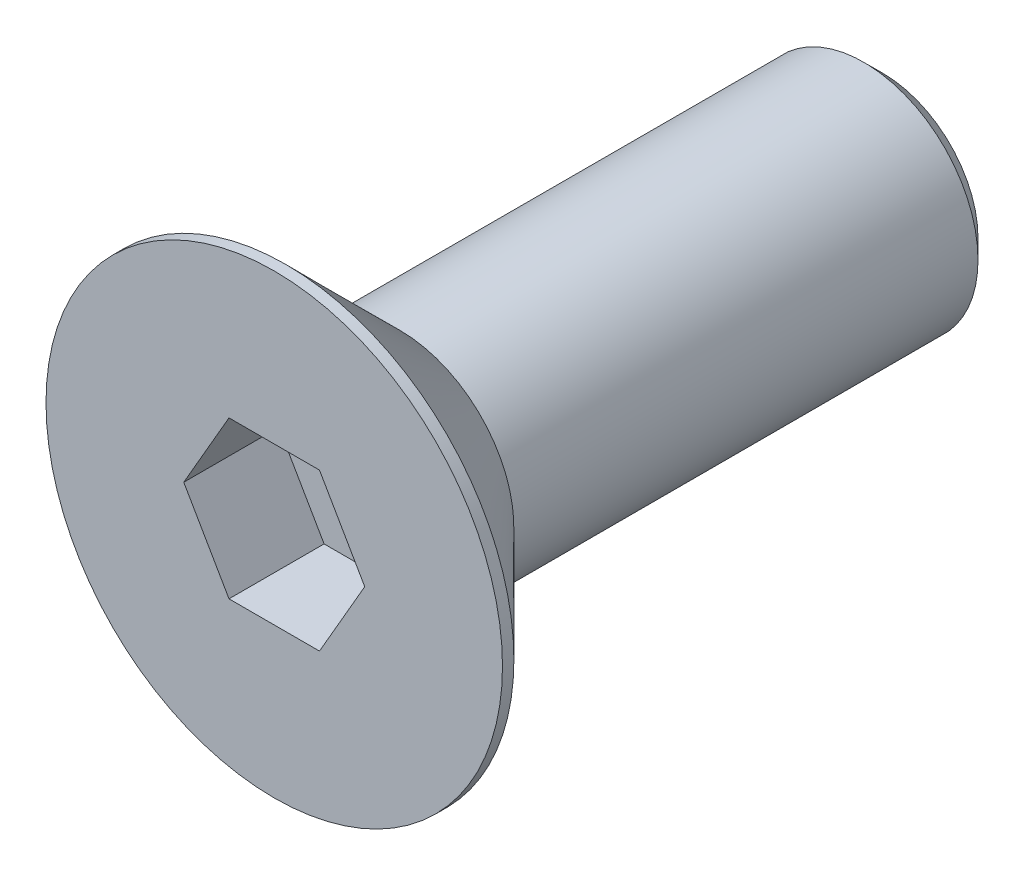
ISO-10303-21;
HEADER;
FILE_DESCRIPTION(('STEP AP214'),'2;1');
FILE_NAME('part.step','',(''),(''),'','','');
FILE_SCHEMA(('AUTOMOTIVE_DESIGN { 1 0 10303 214 1 1 1 1 }'));
ENDSEC;
DATA;
#1=APPLICATION_CONTEXT('core data for automotive mechanical design processes');
#2=APPLICATION_PROTOCOL_DEFINITION('international standard','automotive_design',2000,#1);
#3=PRODUCT_CONTEXT('',#1,'mechanical');
#4=PRODUCT('Part','Part','',(#3));
#5=PRODUCT_RELATED_PRODUCT_CATEGORY('part','',(#4));
#6=PRODUCT_DEFINITION_FORMATION('','',#4);
#7=PRODUCT_DEFINITION_CONTEXT('part definition',#1,'design');
#8=PRODUCT_DEFINITION('design','',#6,#7);
#9=PRODUCT_DEFINITION_SHAPE('','',#8);
#10=(LENGTH_UNIT() NAMED_UNIT(*) SI_UNIT(.MILLI.,.METRE.));
#11=(NAMED_UNIT(*) PLANE_ANGLE_UNIT() SI_UNIT($,.RADIAN.));
#12=(NAMED_UNIT(*) SI_UNIT($,.STERADIAN.) SOLID_ANGLE_UNIT());
#13=UNCERTAINTY_MEASURE_WITH_UNIT(LENGTH_MEASURE(1.E-05),#10,'distance_accuracy_value','');
#14=(GEOMETRIC_REPRESENTATION_CONTEXT(3) GLOBAL_UNCERTAINTY_ASSIGNED_CONTEXT((#13)) GLOBAL_UNIT_ASSIGNED_CONTEXT((#10,
#11,#12)) REPRESENTATION_CONTEXT('',''));
#15=CARTESIAN_POINT('',(0.,0.,0.));
#16=DIRECTION('',(0.,0.,1.));
#17=DIRECTION('',(1.,0.,0.));
#18=AXIS2_PLACEMENT_3D('',#15,#16,#17);
#19=CARTESIAN_POINT('',(-2.37868310899669,-2.06000000000006,-2.49999999999995));
#20=DIRECTION('',(0.,0.,1.));
#21=DIRECTION('',(1.,0.,0.));
#22=AXIS2_PLACEMENT_3D('',#19,#20,#21);
#23=PLANE('',#22);
#24=DIRECTION('',(0.499999999832692,0.866025403881034,0.));
#25=VECTOR('',#24,1.);
#26=CARTESIAN_POINT('',(1.78401233200365,-1.03000000000009,-2.49999999999995));
#27=LINE('',#26,#25);
#28=CARTESIAN_POINT('',(1.18934155474681,-2.05999999999984,-2.49999999999995));
#29=VERTEX_POINT('',#28);
#30=CARTESIAN_POINT('',(2.37868310834743,-1.15235598840968E-09,-2.49999999999995));
#31=VERTEX_POINT('',#30);
#32=EDGE_CURVE('E101',#29,#31,#27,.T.);
#33=ORIENTED_EDGE('',*,*,#32,.T.);
#34=DIRECTION('',(-0.499999999832691,0.86602540388103,0.));
#35=VECTOR('',#34,1.);
#36=CARTESIAN_POINT('',(1.78401233199565,1.03000000000042,-2.49999999999995));
#37=LINE('',#36,#35);
#38=CARTESIAN_POINT('',(1.18934155475792,2.05999999999906,-2.49999999999995));
#39=VERTEX_POINT('',#38);
#40=EDGE_CURVE('E80',#31,#39,#37,.T.);
#41=ORIENTED_EDGE('',*,*,#40,.T.);
#42=DIRECTION('',(-1.,0.,0.));
#43=VECTOR('',#42,1.);
#44=CARTESIAN_POINT('',(3.5527136788005E-12,2.05999999999951,-2.49999999999995));
#45=LINE('',#44,#43);
#46=CARTESIAN_POINT('',(-1.1893415548716,2.05999999999951,-2.49999999999995));
#47=VERTEX_POINT('',#46);
#48=EDGE_CURVE('E76',#39,#47,#45,.T.);
#49=ORIENTED_EDGE('',*,*,#48,.T.);
#50=DIRECTION('',(-0.499999999832692,-0.866025403881034,0.));
#51=VECTOR('',#50,1.);
#52=CARTESIAN_POINT('',(-1.78401233198766,1.02999999999998,-2.49999999999995));
#53=LINE('',#52,#51);
#54=CARTESIAN_POINT('',(-2.37868310833145,1.15130127653629E-09,-2.49999999999995));
#55=VERTEX_POINT('',#54);
#56=EDGE_CURVE('E78',#47,#55,#53,.T.);
#57=ORIENTED_EDGE('',*,*,#56,.T.);
#58=DIRECTION('',(0.499999999832691,-0.86602540388103,0.));
#59=VECTOR('',#58,1.);
#60=CARTESIAN_POINT('',(-1.78401233198766,-1.03000000000064,-2.49999999999995));
#61=LINE('',#60,#59);
#62=CARTESIAN_POINT('',(-1.18934155475348,-2.06000000000001,-2.49999999999995));
#63=VERTEX_POINT('',#62);
#64=EDGE_CURVE('E95',#55,#63,#61,.T.);
#65=ORIENTED_EDGE('',*,*,#64,.T.);
#66=DIRECTION('',(1.,0.,0.));
#67=VECTOR('',#66,1.);
#68=CARTESIAN_POINT('',(4.44089209850063E-12,-2.05999999999951,-2.49999999999995));
#69=LINE('',#68,#67);
#70=EDGE_CURVE('E98',#63,#29,#69,.T.);
#71=ORIENTED_EDGE('',*,*,#70,.T.);
#72=EDGE_LOOP('',(#33,#41,#49,#57,#65,#71));
#73=FACE_BOUND('',#72,.T.);
#74=ADVANCED_FACE('F16',(#73),#23,.T.);
#75=CARTESIAN_POINT('',(1.1893415550035,2.0599999999994,-2.49999999999995));
#76=DIRECTION('',(0.,0.999999999999998,0.));
#77=DIRECTION('',(-1.,0.,0.));
#78=AXIS2_PLACEMENT_3D('',#75,#76,#77);
#79=PLANE('',#78);
#80=DIRECTION('',(0.,0.,-1.));
#81=VECTOR('',#80,1.);
#82=CARTESIAN_POINT('',(-1.18934155499639,2.05999999999956,-1.24999999999997));
#83=LINE('',#82,#81);
#84=CARTESIAN_POINT('',(-1.18934155766715,2.06000000415235,0.));
#85=VERTEX_POINT('',#84);
#86=EDGE_CURVE('E82',#85,#47,#83,.T.);
#87=ORIENTED_EDGE('',*,*,#86,.T.);
#88=ORIENTED_EDGE('',*,*,#48,.F.);
#89=DIRECTION('',(0.,0.,1.));
#90=VECTOR('',#89,1.);
#91=CARTESIAN_POINT('',(1.1893415550035,2.0599999999994,-1.24999999999997));
#92=LINE('',#91,#90);
#93=CARTESIAN_POINT('',(1.18934155767958,2.06000000415196,0.));
#94=VERTEX_POINT('',#93);
#95=EDGE_CURVE('E50',#39,#94,#92,.T.);
#96=ORIENTED_EDGE('',*,*,#95,.T.);
#97=DIRECTION('',(1.,0.,0.));
#98=VECTOR('',#97,1.);
#99=CARTESIAN_POINT('',(3.5527136788005E-12,2.06000000553508,0.));
#100=LINE('',#99,#98);
#101=EDGE_CURVE('E56',#85,#94,#100,.T.);
#102=ORIENTED_EDGE('',*,*,#101,.F.);
#103=EDGE_LOOP('',(#87,#88,#96,#102));
#104=FACE_BOUND('',#103,.T.);
#105=ADVANCED_FACE('F83',(#104),#79,.F.);
#106=CARTESIAN_POINT('',(2.37868310900113,3.33066907387547E-13,-2.49999999999995));
#107=DIRECTION('',(0.86602540388103,0.499999999832692,0.));
#108=DIRECTION('',(-0.499999999832691,0.86602540388103,0.));
#109=AXIS2_PLACEMENT_3D('',#106,#107,#108);
#110=PLANE('',#109);
#111=ORIENTED_EDGE('',*,*,#95,.F.);
#112=ORIENTED_EDGE('',*,*,#40,.F.);
#113=DIRECTION('',(0.,0.,1.));
#114=VECTOR('',#113,1.);
#115=CARTESIAN_POINT('',(2.37868310900113,3.33066907387547E-13,-1.24999999999997));
#116=LINE('',#115,#114);
#117=CARTESIAN_POINT('',(2.37868310870537,4.77395900588817E-11,0.));
#118=VERTEX_POINT('',#117);
#119=EDGE_CURVE('E100',#31,#118,#116,.T.);
#120=ORIENTED_EDGE('',*,*,#119,.T.);
#121=DIRECTION('',(0.499999996998702,-0.866025405517233,0.));
#122=VECTOR('',#121,1.);
#123=CARTESIAN_POINT('',(1.18934156035211,2.06000000553552,0.));
#124=LINE('',#123,#122);
#125=EDGE_CURVE('E20',#94,#118,#124,.T.);
#126=ORIENTED_EDGE('',*,*,#125,.F.);
#127=EDGE_LOOP('',(#111,#112,#120,#126));
#128=FACE_BOUND('',#127,.T.);
#129=ADVANCED_FACE('F127',(#128),#110,.F.);
#130=CARTESIAN_POINT('',(1.18934155499639,-2.06000000000001,-2.49999999999995));
#131=DIRECTION('',(0.866025403881034,-0.499999999832692,0.));
#132=DIRECTION('',(0.499999999832692,0.866025403881034,0.));
#133=AXIS2_PLACEMENT_3D('',#130,#131,#132);
#134=PLANE('',#133);
#135=ORIENTED_EDGE('',*,*,#119,.F.);
#136=ORIENTED_EDGE('',*,*,#32,.F.);
#137=DIRECTION('',(0.,0.,1.));
#138=VECTOR('',#137,1.);
#139=CARTESIAN_POINT('',(1.18934155499639,-2.06000000000001,-1.24999999999997));
#140=LINE('',#139,#138);
#141=CARTESIAN_POINT('',(1.18934155767159,-2.06000000415218,0.));
#142=VERTEX_POINT('',#141);
#143=EDGE_CURVE('E97',#29,#142,#140,.T.);
#144=ORIENTED_EDGE('',*,*,#143,.T.);
#145=DIRECTION('',(-0.499999996998703,-0.866025405517237,0.));
#146=VECTOR('',#145,1.);
#147=CARTESIAN_POINT('',(2.37868310855571,-2.22044604925031E-13,0.));
#148=LINE('',#147,#146);
#149=EDGE_CURVE('E108',#118,#142,#148,.T.);
#150=ORIENTED_EDGE('',*,*,#149,.F.);
#151=EDGE_LOOP('',(#135,#136,#144,#150));
#152=FACE_BOUND('',#151,.T.);
#153=ADVANCED_FACE('F131',(#152),#134,.F.);
#154=CARTESIAN_POINT('',(-1.1893415550035,-2.0599999999994,-2.49999999999995));
#155=DIRECTION('',(0.,-0.999999999999998,0.));
#156=DIRECTION('',(1.,0.,0.));
#157=AXIS2_PLACEMENT_3D('',#154,#155,#156);
#158=PLANE('',#157);
#159=ORIENTED_EDGE('',*,*,#143,.F.);
#160=ORIENTED_EDGE('',*,*,#70,.F.);
#161=DIRECTION('',(0.,0.,1.));
#162=VECTOR('',#161,1.);
#163=CARTESIAN_POINT('',(-1.1893415550035,-2.0599999999994,-1.24999999999997));
#164=LINE('',#163,#162);
#165=CARTESIAN_POINT('',(-1.18934155766359,-2.06000000415263,0.));
#166=VERTEX_POINT('',#165);
#167=EDGE_CURVE('E86',#63,#166,#164,.T.);
#168=ORIENTED_EDGE('',*,*,#167,.T.);
#169=DIRECTION('',(-1.,0.,0.));
#170=VECTOR('',#169,1.);
#171=CARTESIAN_POINT('',(4.44089209850063E-12,-2.06000000553691,0.));
#172=LINE('',#171,#170);
#173=EDGE_CURVE('E105',#142,#166,#172,.T.);
#174=ORIENTED_EDGE('',*,*,#173,.F.);
#175=EDGE_LOOP('',(#159,#160,#168,#174));
#176=FACE_BOUND('',#175,.T.);
#177=ADVANCED_FACE('F136',(#176),#158,.F.);
#178=CARTESIAN_POINT('',(-2.37868310899136,1.11022302462516E-13,-2.49999999999995));
#179=DIRECTION('',(-0.86602540388103,-0.499999999832692,0.));
#180=DIRECTION('',(0.499999999832691,-0.86602540388103,0.));
#181=AXIS2_PLACEMENT_3D('',#178,#179,#180);
#182=PLANE('',#181);
#183=ORIENTED_EDGE('',*,*,#167,.F.);
#184=ORIENTED_EDGE('',*,*,#64,.F.);
#185=DIRECTION('',(0.,0.,1.));
#186=VECTOR('',#185,1.);
#187=CARTESIAN_POINT('',(-2.37868310899136,1.11022302462516E-13,-1.24999999999997));
#188=LINE('',#187,#186);
#189=CARTESIAN_POINT('',(-2.37868310869382,4.79616346638068E-11,0.));
#190=VERTEX_POINT('',#189);
#191=EDGE_CURVE('E35',#55,#190,#188,.T.);
#192=ORIENTED_EDGE('',*,*,#191,.T.);
#193=DIRECTION('',(-0.499999996998702,0.866025405517235,0.));
#194=VECTOR('',#193,1.);
#195=CARTESIAN_POINT('',(-1.18934156034589,-2.06000000553641,0.));
#196=LINE('',#195,#194);
#197=EDGE_CURVE('E107',#166,#190,#196,.T.);
#198=ORIENTED_EDGE('',*,*,#197,.F.);
#199=EDGE_LOOP('',(#183,#184,#192,#198));
#200=FACE_BOUND('',#199,.T.);
#201=ADVANCED_FACE('F138',(#200),#182,.F.);
#202=CARTESIAN_POINT('',(-1.18934155499639,2.05999999999956,-2.49999999999995));
#203=DIRECTION('',(-0.866025403881034,0.499999999832692,0.));
#204=DIRECTION('',(-0.499999999832692,-0.866025403881034,0.));
#205=AXIS2_PLACEMENT_3D('',#202,#203,#204);
#206=PLANE('',#205);
#207=ORIENTED_EDGE('',*,*,#191,.F.);
#208=ORIENTED_EDGE('',*,*,#56,.F.);
#209=ORIENTED_EDGE('',*,*,#86,.F.);
#210=DIRECTION('',(0.499999996998703,0.866025405517237,0.));
#211=VECTOR('',#210,1.);
#212=CARTESIAN_POINT('',(-2.37868310854772,4.44089209850063E-13,0.));
#213=LINE('',#212,#211);
#214=EDGE_CURVE('E117',#190,#85,#213,.T.);
#215=ORIENTED_EDGE('',*,*,#214,.F.);
#216=EDGE_LOOP('',(#207,#208,#209,#215));
#217=FACE_BOUND('',#216,.T.);
#218=ADVANCED_FACE('F88',(#217),#206,.F.);
#219=CARTESIAN_POINT('',(-6.07199999999208,6.07199999999941,0.));
#220=DIRECTION('',(0.,0.,1.));
#221=DIRECTION('',(0.,-0.999999999999998,0.));
#222=AXIS2_PLACEMENT_3D('',#219,#220,#221);
#223=PLANE('',#222);
#224=ORIENTED_EDGE('',*,*,#197,.T.);
#225=ORIENTED_EDGE('',*,*,#214,.T.);
#226=ORIENTED_EDGE('',*,*,#101,.T.);
#227=ORIENTED_EDGE('',*,*,#125,.T.);
#228=ORIENTED_EDGE('',*,*,#149,.T.);
#229=ORIENTED_EDGE('',*,*,#173,.T.);
#230=EDGE_LOOP('',(#224,#225,#226,#227,#228,#229));
#231=FACE_BOUND('',#230,.T.);
#232=CARTESIAN_POINT('',(0.,0.,0.));
#233=DIRECTION('',(0.,0.,-1.));
#234=DIRECTION('',(-1.,0.,0.));
#235=AXIS2_PLACEMENT_3D('',#232,#233,#234);
#236=CIRCLE('',#235,6.);
#237=CARTESIAN_POINT('',(-6.,0.,0.));
#238=VERTEX_POINT('',#237);
#239=EDGE_CURVE('E114',#238,#238,#236,.F.);
#240=ORIENTED_EDGE('',*,*,#239,.T.);
#241=EDGE_LOOP('',(#240));
#242=FACE_BOUND('',#241,.T.);
#243=ADVANCED_FACE('F124',(#231,#242),#223,.T.);
#244=CARTESIAN_POINT('',(0.,0.,0.));
#245=DIRECTION('',(0.,0.,-1.));
#246=DIRECTION('',(-1.,0.,0.));
#247=AXIS2_PLACEMENT_3D('',#244,#245,#246);
#248=CYLINDRICAL_SURFACE('',#247,6.);
#249=CARTESIAN_POINT('',(0.,0.,-0.299999999999967));
#250=DIRECTION('',(0.,0.,1.));
#251=DIRECTION('',(0.,-0.999999999999998,0.));
#252=AXIS2_PLACEMENT_3D('',#249,#250,#251);
#253=CIRCLE('',#252,6.);
#254=CARTESIAN_POINT('',(0.,-5.99999999999999,-0.300000000000007));
#255=VERTEX_POINT('',#254);
#256=EDGE_CURVE('E93',#255,#255,#253,.T.);
#257=ORIENTED_EDGE('',*,*,#256,.T.);
#258=EDGE_LOOP('',(#257));
#259=FACE_BOUND('',#258,.T.);
#260=ORIENTED_EDGE('',*,*,#239,.F.);
#261=EDGE_LOOP('',(#260));
#262=FACE_BOUND('',#261,.T.);
#263=ADVANCED_FACE('F166',(#259,#262),#248,.T.);
#264=CARTESIAN_POINT('',(0.,0.,-3.30000000000008));
#265=DIRECTION('',(0.,0.,1.));
#266=DIRECTION('',(1.,0.,0.));
#267=AXIS2_PLACEMENT_3D('',#264,#265,#266);
#268=CONICAL_SURFACE('',#267,3.,0.785398163397448);
#269=ORIENTED_EDGE('',*,*,#256,.F.);
#270=EDGE_LOOP('',(#269));
#271=FACE_BOUND('',#270,.T.);
#272=CARTESIAN_POINT('',(0.,0.,-3.30000000000008));
#273=DIRECTION('',(0.,0.,-1.));
#274=DIRECTION('',(0.,0.999999999999998,0.));
#275=AXIS2_PLACEMENT_3D('',#272,#273,#274);
#276=CIRCLE('',#275,3.);
#277=CARTESIAN_POINT('',(0.,2.99999999999999,-3.30000000000008));
#278=VERTEX_POINT('',#277);
#279=EDGE_CURVE('E264',#278,#278,#276,.F.);
#280=ORIENTED_EDGE('',*,*,#279,.T.);
#281=EDGE_LOOP('',(#280));
#282=FACE_BOUND('',#281,.T.);
#283=ADVANCED_FACE('F162',(#271,#282),#268,.T.);
#284=CARTESIAN_POINT('',(0.,0.,-3.40000000000007));
#285=DIRECTION('',(0.,0.,-1.));
#286=DIRECTION('',(-1.,0.,0.));
#287=AXIS2_PLACEMENT_3D('',#284,#285,#286);
#288=CYLINDRICAL_SURFACE('',#287,3.);
#289=ORIENTED_EDGE('',*,*,#279,.F.);
#290=EDGE_LOOP('',(#289));
#291=FACE_BOUND('',#290,.T.);
#292=CARTESIAN_POINT('',(0.,0.,-15.5000000000001));
#293=DIRECTION('',(0.,0.,1.));
#294=DIRECTION('',(0.,-0.999999999999998,0.));
#295=AXIS2_PLACEMENT_3D('',#292,#293,#294);
#296=CIRCLE('',#295,3.);
#297=CARTESIAN_POINT('',(0.,-2.99999999999999,-15.5));
#298=VERTEX_POINT('',#297);
#299=EDGE_CURVE('E26',#298,#298,#296,.T.);
#300=ORIENTED_EDGE('',*,*,#299,.T.);
#301=EDGE_LOOP('',(#300));
#302=FACE_BOUND('',#301,.T.);
#303=ADVANCED_FACE('F155',(#291,#302),#288,.T.);
#304=CARTESIAN_POINT('',(-2.5300000000037,-2.53000000000003,-16.));
#305=DIRECTION('',(0.,0.,-1.));
#306=DIRECTION('',(0.,0.999999999999998,0.));
#307=AXIS2_PLACEMENT_3D('',#304,#305,#306);
#308=PLANE('',#307);
#309=CARTESIAN_POINT('',(0.,0.,-16.));
#310=DIRECTION('',(0.,0.,1.));
#311=DIRECTION('',(1.,0.,0.));
#312=AXIS2_PLACEMENT_3D('',#309,#310,#311);
#313=CIRCLE('',#312,2.49999999999999);
#314=CARTESIAN_POINT('',(2.49999999999999,0.,-16.));
#315=VERTEX_POINT('',#314);
#316=EDGE_CURVE('E11',#315,#315,#313,.F.);
#317=ORIENTED_EDGE('',*,*,#316,.T.);
#318=EDGE_LOOP('',(#317));
#319=FACE_BOUND('',#318,.T.);
#320=ADVANCED_FACE('F18',(#319),#308,.T.);
#321=CARTESIAN_POINT('',(0.,0.,-16.));
#322=DIRECTION('',(0.,0.,1.));
#323=DIRECTION('',(1.,0.,0.));
#324=AXIS2_PLACEMENT_3D('',#321,#322,#323);
#325=CONICAL_SURFACE('',#324,2.5,0.785398163397448);
#326=ORIENTED_EDGE('',*,*,#316,.F.);
#327=EDGE_LOOP('',(#326));
#328=FACE_BOUND('',#327,.T.);
#329=ORIENTED_EDGE('',*,*,#299,.F.);
#330=EDGE_LOOP('',(#329));
#331=FACE_BOUND('',#330,.T.);
#332=ADVANCED_FACE('F148',(#328,#331),#325,.T.);
#333=CLOSED_SHELL('',(#74,#105,#129,#153,#177,#201,#218,#243,#263,#283,#303,#320,#332));
#334=MANIFOLD_SOLID_BREP('B1',#333);
#335=ADVANCED_BREP_SHAPE_REPRESENTATION('',(#18,#334),#14);
#336=SHAPE_DEFINITION_REPRESENTATION(#9,#335);
ENDSEC;
END-ISO-10303-21;
